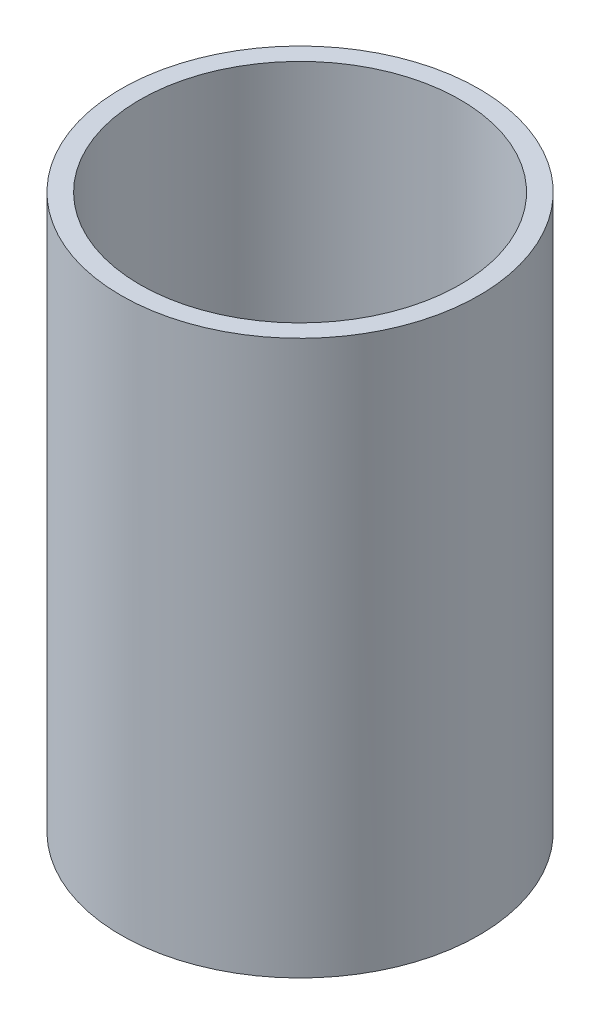
ISO-10303-21;
HEADER;
FILE_DESCRIPTION(('STEP AP214'),'2;1');
FILE_NAME('part.step','',(''),(''),'','','');
FILE_SCHEMA(('AUTOMOTIVE_DESIGN { 1 0 10303 214 1 1 1 1 }'));
ENDSEC;
DATA;
#1=APPLICATION_CONTEXT('core data for automotive mechanical design processes');
#2=APPLICATION_PROTOCOL_DEFINITION('international standard','automotive_design',2000,#1);
#3=PRODUCT_CONTEXT('',#1,'mechanical');
#4=PRODUCT('Part','Part','',(#3));
#5=PRODUCT_RELATED_PRODUCT_CATEGORY('part','',(#4));
#6=PRODUCT_DEFINITION_FORMATION('','',#4);
#7=PRODUCT_DEFINITION_CONTEXT('part definition',#1,'design');
#8=PRODUCT_DEFINITION('design','',#6,#7);
#9=PRODUCT_DEFINITION_SHAPE('','',#8);
#10=(LENGTH_UNIT() NAMED_UNIT(*) SI_UNIT(.MILLI.,.METRE.));
#11=(NAMED_UNIT(*) PLANE_ANGLE_UNIT() SI_UNIT($,.RADIAN.));
#12=(NAMED_UNIT(*) SI_UNIT($,.STERADIAN.) SOLID_ANGLE_UNIT());
#13=UNCERTAINTY_MEASURE_WITH_UNIT(LENGTH_MEASURE(1.E-05),#10,'distance_accuracy_value','');
#14=(GEOMETRIC_REPRESENTATION_CONTEXT(3) GLOBAL_UNCERTAINTY_ASSIGNED_CONTEXT((#13)) GLOBAL_UNIT_ASSIGNED_CONTEXT((#10,
#11,#12)) REPRESENTATION_CONTEXT('',''));
#15=CARTESIAN_POINT('',(0.,0.,0.));
#16=DIRECTION('',(0.,0.,1.));
#17=DIRECTION('',(1.,0.,0.));
#18=AXIS2_PLACEMENT_3D('',#15,#16,#17);
#19=CARTESIAN_POINT('',(0.,58.8,0.));
#20=DIRECTION('',(0.,1.,0.));
#21=DIRECTION('',(0.,0.,1.));
#22=AXIS2_PLACEMENT_3D('',#19,#20,#21);
#23=PLANE('',#22);
#24=CARTESIAN_POINT('',(0.,58.8,0.));
#25=DIRECTION('',(0.,1.,0.));
#26=DIRECTION('',(0.,0.,1.));
#27=AXIS2_PLACEMENT_3D('',#24,#25,#26);
#28=CIRCLE('',#27,19.);
#29=CARTESIAN_POINT('',(0.,58.8,19.));
#30=VERTEX_POINT('',#29);
#31=EDGE_CURVE('E48',#30,#30,#28,.T.);
#32=ORIENTED_EDGE('',*,*,#31,.T.);
#33=EDGE_LOOP('',(#32));
#34=FACE_BOUND('',#33,.T.);
#35=CARTESIAN_POINT('',(0.,58.8,0.));
#36=DIRECTION('',(0.,1.,0.));
#37=DIRECTION('',(0.,0.,1.));
#38=AXIS2_PLACEMENT_3D('',#35,#36,#37);
#39=CIRCLE('',#38,17.);
#40=CARTESIAN_POINT('',(0.,58.8,17.));
#41=VERTEX_POINT('',#40);
#42=EDGE_CURVE('E79',#41,#41,#39,.T.);
#43=ORIENTED_EDGE('',*,*,#42,.F.);
#44=EDGE_LOOP('',(#43));
#45=FACE_BOUND('',#44,.T.);
#46=ADVANCED_FACE('F33',(#34,#45),#23,.T.);
#47=CARTESIAN_POINT('',(0.,0.,0.));
#48=DIRECTION('',(0.,1.,0.));
#49=DIRECTION('',(0.,0.,1.));
#50=AXIS2_PLACEMENT_3D('',#47,#48,#49);
#51=PLANE('',#50);
#52=CARTESIAN_POINT('',(0.,0.,0.));
#53=DIRECTION('',(0.,1.,0.));
#54=DIRECTION('',(0.,0.,1.));
#55=AXIS2_PLACEMENT_3D('',#52,#53,#54);
#56=CIRCLE('',#55,19.);
#57=CARTESIAN_POINT('',(-10.45,0.,-15.8681284340656));
#58=VERTEX_POINT('',#57);
#59=CARTESIAN_POINT('',(10.45,0.,-15.8681284340656));
#60=VERTEX_POINT('',#59);
#61=EDGE_CURVE('E75',#58,#60,#56,.T.);
#62=ORIENTED_EDGE('',*,*,#61,.F.);
#63=DIRECTION('',(0.,0.,1.));
#64=VECTOR('',#63,1.);
#65=CARTESIAN_POINT('',(-10.45,0.,-19.));
#66=LINE('',#65,#64);
#67=CARTESIAN_POINT('',(-10.45,0.,-13.4088590118623));
#68=VERTEX_POINT('',#67);
#69=EDGE_CURVE('E67',#58,#68,#66,.T.);
#70=ORIENTED_EDGE('',*,*,#69,.T.);
#71=CARTESIAN_POINT('',(0.,0.,0.));
#72=DIRECTION('',(0.,1.,0.));
#73=DIRECTION('',(0.,0.,1.));
#74=AXIS2_PLACEMENT_3D('',#71,#72,#73);
#75=CIRCLE('',#74,17.);
#76=CARTESIAN_POINT('',(10.45,0.,-13.4088590118623));
#77=VERTEX_POINT('',#76);
#78=EDGE_CURVE('E74',#68,#77,#75,.T.);
#79=ORIENTED_EDGE('',*,*,#78,.T.);
#80=DIRECTION('',(0.,0.,1.));
#81=VECTOR('',#80,1.);
#82=CARTESIAN_POINT('',(10.45,0.,-19.));
#83=LINE('',#82,#81);
#84=EDGE_CURVE('E54',#77,#60,#83,.F.);
#85=ORIENTED_EDGE('',*,*,#84,.T.);
#86=EDGE_LOOP('',(#62,#70,#79,#85));
#87=FACE_BOUND('',#86,.T.);
#88=ADVANCED_FACE('F73',(#87),#51,.F.);
#89=CARTESIAN_POINT('',(0.,58.8,0.));
#90=DIRECTION('',(0.,-1.,0.));
#91=DIRECTION('',(0.,0.,-1.));
#92=AXIS2_PLACEMENT_3D('',#89,#90,#91);
#93=CYLINDRICAL_SURFACE('',#92,19.);
#94=ORIENTED_EDGE('',*,*,#31,.F.);
#95=EDGE_LOOP('',(#94));
#96=FACE_BOUND('',#95,.T.);
#97=ORIENTED_EDGE('',*,*,#61,.T.);
#98=CARTESIAN_POINT('',(10.45,0.,-15.8681284340656));
#99=CARTESIAN_POINT('',(10.4500012730181,0.13461668501087,-15.8681246559729));
#100=CARTESIAN_POINT('',(10.4473981935161,0.269213552162404,-15.8698422115779));
#101=CARTESIAN_POINT('',(10.4370032538798,0.53811301378984,-15.8766816326083));
#102=CARTESIAN_POINT('',(10.4292116748264,0.672415623811373,-15.8818033136192));
#103=CARTESIAN_POINT('',(10.3981046596639,1.07425060990325,-15.9022035166576));
#104=CARTESIAN_POINT('',(10.3670568574151,1.3409837410607,-15.9225173529007));
#105=CARTESIAN_POINT('',(10.2850919997626,1.86818286049645,-15.9755820898262));
#106=CARTESIAN_POINT('',(10.2343115002847,2.12867913282309,-16.0082474732981));
#107=CARTESIAN_POINT('',(10.1135634255716,2.6435306280742,-16.0848045161732));
#108=CARTESIAN_POINT('',(10.0435929241274,2.89788490798893,-16.1286978876201));
#109=CARTESIAN_POINT('',(9.88553018246523,3.39814977169438,-16.2260552771701));
#110=CARTESIAN_POINT('',(9.79749089995467,3.64408263393226,-16.2794912687168));
#111=CARTESIAN_POINT('',(9.60403995683279,4.12705630531565,-16.3943606685431));
#112=CARTESIAN_POINT('',(9.49862864822693,4.36409729451573,-16.4557939147708));
#113=CARTESIAN_POINT('',(9.27108162313205,4.82872471800875,-16.5850592272797));
#114=CARTESIAN_POINT('',(9.14891684383235,5.0562938067302,-16.6529023479392));
#115=CARTESIAN_POINT('',(8.88879269546811,5.50074339969534,-16.7931891214218));
#116=CARTESIAN_POINT('',(8.75083177189294,5.71762284895399,-16.8656332267182));
#117=CARTESIAN_POINT('',(8.44524660649842,6.16116284753757,-17.0208707913538));
#118=CARTESIAN_POINT('',(8.27603504615457,6.38662283459905,-17.1039735239912));
#119=CARTESIAN_POINT('',(7.92025692286624,6.82284825455656,-17.2716010378501));
#120=CARTESIAN_POINT('',(7.7336893321389,7.03361281592981,-17.356125903044));
#121=CARTESIAN_POINT('',(7.34394254747332,7.43963895807659,-17.5245996758007));
#122=CARTESIAN_POINT('',(7.14075577283886,7.63489338308757,-17.6085483013791));
#123=CARTESIAN_POINT('',(6.71875429802652,8.00876285843584,-17.7738481776533));
#124=CARTESIAN_POINT('',(6.49994473541627,8.18738333474212,-17.8552002696029));
#125=CARTESIAN_POINT('',(6.02796580951805,8.54169470713606,-18.0203050555937));
#126=CARTESIAN_POINT('',(5.77346113451382,8.71579938254646,-18.1036579714908));
#127=CARTESIAN_POINT('',(5.2482990315859,9.04175683559255,-18.262821138262));
#128=CARTESIAN_POINT('',(4.97764042634379,9.19360798857028,-18.3386308383007));
#129=CARTESIAN_POINT('',(4.42196345972372,9.47340695365971,-18.4804871163755));
#130=CARTESIAN_POINT('',(4.13695324241697,9.60136813271735,-18.5465391496878));
#131=CARTESIAN_POINT('',(3.55446192453809,9.83190572268642,-18.6669279387466));
#132=CARTESIAN_POINT('',(3.25698249065589,9.93448551361228,-18.7212662542732));
#133=CARTESIAN_POINT('',(2.6771615603643,10.1053902418416,-18.8125395654125));
#134=CARTESIAN_POINT('',(2.39561869371008,10.1758545416881,-18.8505461022332));
#135=CARTESIAN_POINT('',(1.82629028871862,10.2932803825418,-18.9141925377618));
#136=CARTESIAN_POINT('',(1.53850506778544,10.3402431156203,-18.9398330637093));
#137=CARTESIAN_POINT('',(0.959332065107876,10.4099571173657,-18.9779834579204));
#138=CARTESIAN_POINT('',(0.667946639160726,10.4327234497428,-18.9905014956532));
#139=CARTESIAN_POINT('',(0.0840349414601904,10.4537440281592,-19.0020572982258));
#140=CARTESIAN_POINT('',(-0.208491238125635,10.4520002150995,-19.0010961304523));
#141=CARTESIAN_POINT('',(-0.76138192815084,10.4255062807613,-18.986537018077));
#142=CARTESIAN_POINT('',(-1.0219025811858,10.403187633873,-18.97427465686));
#143=CARTESIAN_POINT('',(-1.53982717952238,10.3392215954069,-18.9392788647418));
#144=CARTESIAN_POINT('',(-1.79723139030732,10.2975758623221,-18.9165463323066));
#145=CARTESIAN_POINT('',(-2.30717744119804,10.1954431478755,-18.8611432232997));
#146=CARTESIAN_POINT('',(-2.55971918993879,10.1349558128485,-18.8284724601834));
#147=CARTESIAN_POINT('',(-3.0583494215066,9.9957993910089,-18.7539343956568));
#148=CARTESIAN_POINT('',(-3.3044376532629,9.91712959798211,-18.7120667370384));
#149=CARTESIAN_POINT('',(-3.79129051288054,9.74147282440722,-18.6195639348381));
#150=CARTESIAN_POINT('',(-4.03197210941064,9.64430218314055,-18.5688413468723));
#151=CARTESIAN_POINT('',(-4.50414244029669,9.4330338050988,-18.4599953673567));
#152=CARTESIAN_POINT('',(-4.73562783881111,9.31892999576798,-18.4018693218507));
#153=CARTESIAN_POINT('',(-5.18824121521788,9.07473258130145,-18.279417775016));
#154=CARTESIAN_POINT('',(-5.4093704451548,8.94464091600042,-18.215093025991));
#155=CARTESIAN_POINT('',(-5.8404943223379,8.66928944402046,-18.0814707607809));
#156=CARTESIAN_POINT('',(-6.05048492934414,8.52402418949034,-18.0121714613699));
#157=CARTESIAN_POINT('',(-6.48046570029447,8.2027814443386,-17.8622736907849));
#158=CARTESIAN_POINT('',(-6.69910080414364,8.02518116012107,-17.781261737982));
#159=CARTESIAN_POINT('',(-7.12080538383842,7.65347289427305,-17.6166222801085));
#160=CARTESIAN_POINT('',(-7.32387371151186,7.45936369720357,-17.5329945827455));
#161=CARTESIAN_POINT('',(-7.71384060763866,7.0553580762284,-17.3649587686544));
#162=CARTESIAN_POINT('',(-7.90071979251648,6.8454432747917,-17.2805498467567));
#163=CARTESIAN_POINT('',(-8.2572086769888,6.41092680055438,-17.1130738002932));
#164=CARTESIAN_POINT('',(-8.42681820307707,6.18632498023225,-17.0300066892155));
#165=CARTESIAN_POINT('',(-8.76216156562717,5.70272877671721,-16.8600984974949));
#166=CARTESIAN_POINT('',(-8.92621372321556,5.44245142974373,-16.773577332291));
#167=CARTESIAN_POINT('',(-9.23157338358674,4.906691886618,-16.6074766862903));
#168=CARTESIAN_POINT('',(-9.37287755167582,4.63120746915158,-16.5278982240262));
#169=CARTESIAN_POINT('',(-9.63098465736375,4.06725341716415,-16.3788369713242));
#170=CARTESIAN_POINT('',(-9.74785006769433,3.77881923955143,-16.3093285822235));
#171=CARTESIAN_POINT('',(-9.95602284359848,3.19021170942761,-16.1830919535635));
#172=CARTESIAN_POINT('',(-10.0473407557039,2.89004325956497,-16.1263584421653));
#173=CARTESIAN_POINT('',(-10.1785121378221,2.37632489918034,-16.0437477570263));
#174=CARTESIAN_POINT('',(-10.2255185262193,2.16522953748394,-16.0137780908027));
#175=CARTESIAN_POINT('',(-10.3064606327971,1.73961768410317,-15.9618037153635));
#176=CARTESIAN_POINT('',(-10.3404001006948,1.52510219229721,-15.9397967212684));
#177=CARTESIAN_POINT('',(-10.3949890356453,1.09284314467457,-15.9042551230562));
#178=CARTESIAN_POINT('',(-10.4155869370567,0.875090352569286,-15.8907533975621));
#179=CARTESIAN_POINT('',(-10.443108726044,0.438231926282308,-15.8726660496449));
#180=CARTESIAN_POINT('',(-10.4500248155989,0.219125591959081,-15.8680855119231));
#181=CARTESIAN_POINT('',(-10.45,0.,-15.8681284340656));
#182=B_SPLINE_CURVE_WITH_KNOTS('',3,(#98,#99,#100,#101,#102,#103,#104,#105,#106,#107,#108,#109,
#110,#111,#112,#113,#114,#115,#116,#117,#118,#119,#120,#121,#122,#123,#124,#125,#126,#127,#128,
#129,#130,#131,#132,#133,#134,#135,#136,#137,#138,#139,#140,#141,#142,#143,#144,#145,#146,#147,
#148,#149,#150,#151,#152,#153,#154,#155,#156,#157,#158,#159,#160,#161,#162,#163,#164,#165,#166,
#167,#168,#169,#170,#171,#172,#173,#174,#175,#176,#177,#178,#179,#180,#181),.UNSPECIFIED.,.F.,
.F.,(4,2,2,2,2,2,2,2,2,2,2,2,2,2,2,2,2,2,2,2,2,2,2,2,2,2,2,2,2,2,2,2,2,2,2,2,2,2,2,2,2,4),(0.,
0.403774900877858,0.807527929500476,1.61421634347208,2.41541890435949,3.21674370550549,
4.01575261388323,4.81474533411241,5.61514205241605,6.41561760618316,7.29637563173928,
8.17718584693272,9.05840010095439,9.93932588987509,10.896356113444,11.853456171935,
12.8100190971677,13.7664545692164,14.6433457334633,15.5201924145922,16.3964928857487,
17.2727239651172,18.0570787544756,18.8413662493439,19.6256684665201,20.4100011514402,
21.202569498715,21.9954227660016,22.7881799298052,23.5812227060215,24.4595921876933,
25.338026393811,26.2174982342825,27.0969789098323,28.0545593291094,29.0122799953022,
29.9675216788514,30.92236843516,31.5768566276699,32.2311568663348,32.8879711427837,
33.5451596662769),.UNSPECIFIED.);
#183=EDGE_CURVE('E60',#60,#58,#182,.T.);
#184=ORIENTED_EDGE('',*,*,#183,.T.);
#185=EDGE_LOOP('',(#97,#184));
#186=FACE_BOUND('',#185,.T.);
#187=ADVANCED_FACE('F35',(#96,#186),#93,.T.);
#188=CARTESIAN_POINT('',(0.,58.8,0.));
#189=DIRECTION('',(0.,-1.,0.));
#190=DIRECTION('',(0.,0.,-1.));
#191=AXIS2_PLACEMENT_3D('',#188,#189,#190);
#192=CYLINDRICAL_SURFACE('',#191,17.);
#193=CARTESIAN_POINT('',(10.45,0.,-13.4088590118623));
#194=CARTESIAN_POINT('',(10.4500016789845,0.131366220527547,-13.4088541572394));
#195=CARTESIAN_POINT('',(10.4475222672895,0.262711794734319,-13.4107904105973));
#196=CARTESIAN_POINT('',(10.4376246403045,0.525094430575268,-13.4184965470656));
#197=CARTESIAN_POINT('',(10.4302067967983,0.656131514688558,-13.4242661415876));
#198=CARTESIAN_POINT('',(10.400605590222,1.0480716739121,-13.4472327477521));
#199=CARTESIAN_POINT('',(10.3710744194583,1.30814379814734,-13.4700878319086));
#200=CARTESIAN_POINT('',(10.2932705861211,1.82152862230625,-13.5296315402958));
#201=CARTESIAN_POINT('',(10.2451571605142,2.07487971644789,-13.5662025535829));
#202=CARTESIAN_POINT('',(10.1309307273382,2.5753936509826,-13.6517151181135));
#203=CARTESIAN_POINT('',(10.0648137995665,2.82255513079347,-13.7006593634209));
#204=CARTESIAN_POINT('',(9.9157551274329,3.30825773719713,-13.8089183449436));
#205=CARTESIAN_POINT('',(9.83288230639037,3.54682960706515,-13.8681904649574));
#206=CARTESIAN_POINT('',(9.65106590346022,4.01529722026574,-13.9953298109086));
#207=CARTESIAN_POINT('',(9.55212286921314,4.24519325892428,-14.0631967439348));
#208=CARTESIAN_POINT('',(9.23185957800874,4.92183310881298,-14.2772046451817));
#209=CARTESIAN_POINT('',(8.98735726104967,5.35471842626176,-14.4335609359013));
#210=CARTESIAN_POINT('',(8.56152102231486,5.99837841849143,-14.6878355359943));
#211=CARTESIAN_POINT('',(8.39905671873859,6.22377381344076,-14.7815453362588));
#212=CARTESIAN_POINT('',(8.05705211526095,6.66057646250158,-14.9707063775197));
#213=CARTESIAN_POINT('',(7.87751062933237,6.87198274332373,-15.0661577390966));
#214=CARTESIAN_POINT('',(7.50200073041894,7.28007118469729,-15.2566163813905));
#215=CARTESIAN_POINT('',(7.30602411072884,7.47674589528631,-15.3516234149375));
#216=CARTESIAN_POINT('',(6.89843574862988,7.85437670281038,-15.5390437858373));
#217=CARTESIAN_POINT('',(6.68682890936302,8.03533769065375,-15.6314579241248));
#218=CARTESIAN_POINT('',(6.22318813172866,8.40067472457449,-15.8221938533834));
#219=CARTESIAN_POINT('',(5.9693116694122,8.58301351918576,-15.9199580569214));
#220=CARTESIAN_POINT('',(5.44401157593135,8.92544308029453,-16.1071562760401));
#221=CARTESIAN_POINT('',(5.17258624093414,9.08553168173755,-16.1965894806942));
#222=CARTESIAN_POINT('',(4.61387811632684,9.38160441117704,-16.3645087120849));
#223=CARTESIAN_POINT('',(4.32660603717115,9.51760456445695,-16.4430020093315));
#224=CARTESIAN_POINT('',(3.73801548887644,9.76378230626955,-16.5867100642199));
#225=CARTESIAN_POINT('',(3.43669948300293,9.87396440293508,-16.6519271397829));
#226=CARTESIAN_POINT('',(2.85296304022828,10.0571961144908,-16.7612603522348));
#227=CARTESIAN_POINT('',(2.57162886042507,10.132843346281,-16.8068270356898));
#228=CARTESIAN_POINT('',(2.00179907478319,10.2606300441176,-16.8841770592588));
#229=CARTESIAN_POINT('',(1.71330390039305,10.3127709228075,-16.9159612276458));
#230=CARTESIAN_POINT('',(1.13196010348985,10.3926504156591,-16.9647777371909));
#231=CARTESIAN_POINT('',(0.8391153214937,10.4204093906867,-16.9818223868577));
#232=CARTESIAN_POINT('',(0.251650308829441,10.4511078120876,-17.0006764963493));
#233=CARTESIAN_POINT('',(-0.0429697240494779,10.4540499740626,-17.0024876231158));
#234=CARTESIAN_POINT('',(-0.592782921886365,10.4363131977744,-16.9915893232121));
#235=CARTESIAN_POINT('',(-0.848117536596136,10.4186583290978,-16.9807388347227));
#236=CARTESIAN_POINT('',(-1.35605911944277,10.364787132907,-16.9477389571389));
#237=CARTESIAN_POINT('',(-1.60866638039185,10.328572818605,-16.9255907935466));
#238=CARTESIAN_POINT('',(-2.10941622031665,10.2380472679114,-16.870501610569));
#239=CARTESIAN_POINT('',(-2.3575586334468,10.1837353607463,-16.8375601911404));
#240=CARTESIAN_POINT('',(-2.84779298464469,10.0576656414719,-16.7616111458558));
#241=CARTESIAN_POINT('',(-3.08988466956758,9.98590710078902,-16.7186030996189));
#242=CARTESIAN_POINT('',(-3.56750323884862,9.82543276165759,-16.6232502846652));
#243=CARTESIAN_POINT('',(-3.8030025857644,9.73665533459388,-16.5708716307036));
#244=CARTESIAN_POINT('',(-4.26540382756849,9.54314803479644,-16.4579160849065));
#245=CARTESIAN_POINT('',(-4.49230263473467,9.43841249935007,-16.3973362837594));
#246=CARTESIAN_POINT('',(-4.93638983107259,9.21392672095255,-16.2691566174627));
#247=CARTESIAN_POINT('',(-5.15358069168548,9.09418032932807,-16.201558553746));
#248=CARTESIAN_POINT('',(-5.57760030877382,8.84047200489378,-16.0605206469045));
#249=CARTESIAN_POINT('',(-5.78442531644257,8.70650498303678,-15.9870787148415));
#250=CARTESIAN_POINT('',(-6.21159968858565,8.40800008446845,-15.8263786899815));
#251=CARTESIAN_POINT('',(-6.43051507990369,8.24172685009958,-15.7385287542204));
#252=CARTESIAN_POINT('',(-6.85365645458797,7.89335253131125,-15.5589277981068));
#253=CARTESIAN_POINT('',(-7.05788135598756,7.71125028324875,-15.4671764912054));
#254=CARTESIAN_POINT('',(-7.45130945292394,7.33180067954512,-15.2815370133693));
#255=CARTESIAN_POINT('',(-7.6404874454889,7.13442879482267,-15.1876455826355));
#256=CARTESIAN_POINT('',(-8.0028202731944,6.7254746543183,-14.9998836905459));
#257=CARTESIAN_POINT('',(-8.17597445606017,6.5138918206615,-14.9060132301989));
#258=CARTESIAN_POINT('',(-8.52629228374866,6.04976469002462,-14.7087608914549));
#259=CARTESIAN_POINT('',(-8.70123066437343,5.7954125907483,-14.605664251382));
#260=CARTESIAN_POINT('',(-9.02887000394669,5.27045973328591,-14.4054289768934));
#261=CARTESIAN_POINT('',(-9.18156733704143,4.99985633585977,-14.3082913154328));
#262=CARTESIAN_POINT('',(-9.4628804341553,4.44443127377249,-14.1238132069251));
#263=CARTESIAN_POINT('',(-9.59157584425559,4.15966075475266,-14.0364407570738));
#264=CARTESIAN_POINT('',(-9.82392353738528,3.57651296441628,-13.8748183284782));
#265=CARTESIAN_POINT('',(-9.92758421873631,3.27814029621129,-13.8005639513059));
#266=CARTESIAN_POINT('',(-10.0881609343868,2.73724644067248,-13.6834415964154));
#267=CARTESIAN_POINT('',(-10.150345126634,2.4969971780395,-13.6372647011029));
#268=CARTESIAN_POINT('',(-10.2577238457191,2.01085384396039,-13.5566816989895));
#269=CARTESIAN_POINT('',(-10.3029244168148,1.76496181382482,-13.5222714049955));
#270=CARTESIAN_POINT('',(-10.3759666287514,1.26711146965298,-13.4663088771022));
#271=CARTESIAN_POINT('',(-10.4036692599731,1.01512069306391,-13.4448596672739));
#272=CARTESIAN_POINT('',(-10.4314356690218,0.635455328117067,-13.4233106521757));
#273=CARTESIAN_POINT('',(-10.4383932457931,0.508536061201726,-13.4178983904864));
#274=CARTESIAN_POINT('',(-10.4476763220687,0.254417414971308,-13.4106703006094));
#275=CARTESIAN_POINT('',(-10.4500014997864,0.127218016811463,-13.408854722263));
#276=CARTESIAN_POINT('',(-10.45,0.,-13.4088590118623));
#277=B_SPLINE_CURVE_WITH_KNOTS('',3,(#193,#194,#195,#196,#197,#198,#199,#200,#201,#202,#203,
#204,#205,#206,#207,#208,#209,#210,#211,#212,#213,#214,#215,#216,#217,#218,#219,#220,#221,#222,
#223,#224,#225,#226,#227,#228,#229,#230,#231,#232,#233,#234,#235,#236,#237,#238,#239,#240,#241,
#242,#243,#244,#245,#246,#247,#248,#249,#250,#251,#252,#253,#254,#255,#256,#257,#258,#259,#260,
#261,#262,#263,#264,#265,#266,#267,#268,#269,#270,#271,#272,#273,#274,#275,#276),.UNSPECIFIED.,
.F.,.F.,(4,2,2,2,2,2,2,2,2,2,2,2,2,2,2,2,2,2,2,2,2,2,2,2,2,2,2,2,2,2,2,2,2,2,2,2,2,2,2,2,2,4),
(0.,0.394020520272171,0.788011380548565,1.57497685216363,2.35534307528147,3.13587935661562,
3.91326803027607,4.69063021765164,6.24793899173511,7.12696615499734,8.0060544122054,
8.88558427651731,9.76483939782743,10.7460513373218,11.7273586868751,12.7080107313461,
13.6884914147566,14.5718150911893,15.4550856761081,16.3376179552878,17.2200536613366,
17.9876550034102,18.7551730985337,19.5227196443004,20.2902982484089,21.0607107784408,
21.8313973277269,22.6018865455762,23.3726524290886,24.2375676876565,25.1025465828596,
25.9689450406774,26.835378751129,27.8105769014045,28.785933856149,29.7579943221836,
30.7297282397746,31.4861697211284,32.2423417388797,33.0044478925343,33.3860046963116,
33.7675880037605),.UNSPECIFIED.);
#278=EDGE_CURVE('E11',#77,#68,#277,.T.);
#279=ORIENTED_EDGE('',*,*,#278,.F.);
#280=ORIENTED_EDGE('',*,*,#78,.F.);
#281=EDGE_LOOP('',(#279,#280));
#282=FACE_BOUND('',#281,.T.);
#283=ORIENTED_EDGE('',*,*,#42,.T.);
#284=EDGE_LOOP('',(#283));
#285=FACE_BOUND('',#284,.T.);
#286=ADVANCED_FACE('F77',(#282,#285),#192,.F.);
#287=CARTESIAN_POINT('',(0.,0.,-19.));
#288=DIRECTION('',(0.,0.,1.));
#289=DIRECTION('',(1.,0.,0.));
#290=AXIS2_PLACEMENT_3D('',#287,#288,#289);
#291=CYLINDRICAL_SURFACE('',#290,10.45);
#292=ORIENTED_EDGE('',*,*,#84,.F.);
#293=ORIENTED_EDGE('',*,*,#278,.T.);
#294=ORIENTED_EDGE('',*,*,#69,.F.);
#295=ORIENTED_EDGE('',*,*,#183,.F.);
#296=EDGE_LOOP('',(#292,#293,#294,#295));
#297=FACE_BOUND('',#296,.T.);
#298=ADVANCED_FACE('F66',(#297),#291,.F.);
#299=CLOSED_SHELL('',(#46,#88,#187,#286,#298));
#300=MANIFOLD_SOLID_BREP('B2',#299);
#301=ADVANCED_BREP_SHAPE_REPRESENTATION('',(#18,#300),#14);
#302=SHAPE_DEFINITION_REPRESENTATION(#9,#301);
ENDSEC;
END-ISO-10303-21;
